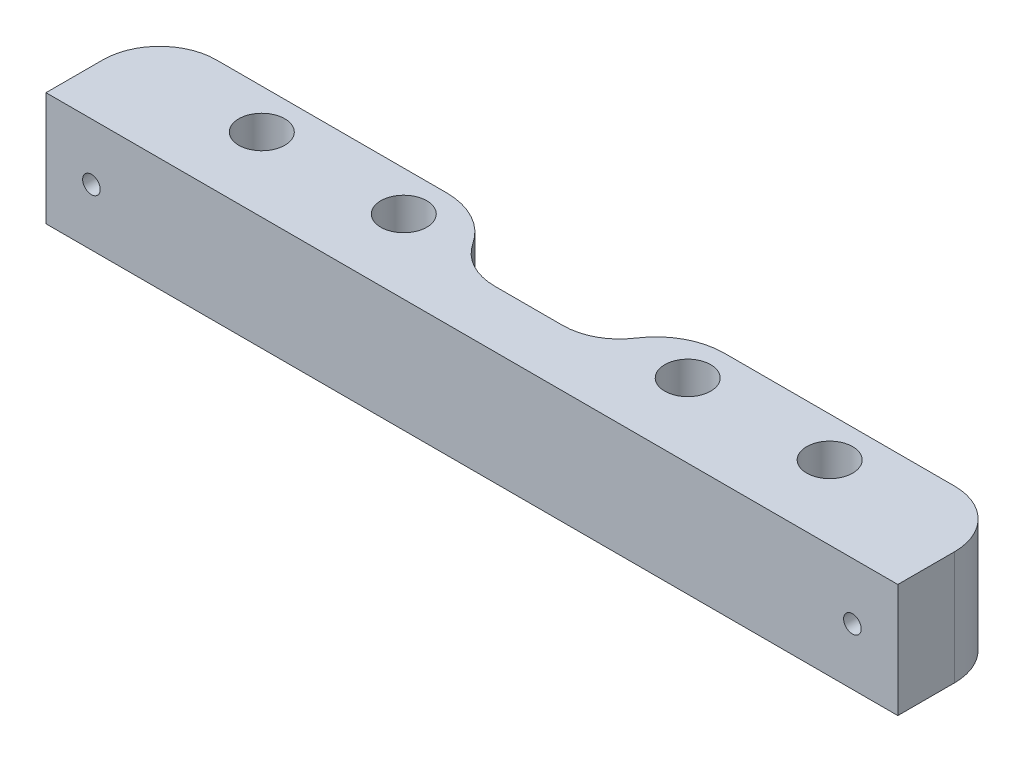
ISO-10303-21;
HEADER;
FILE_DESCRIPTION(('STEP AP214'),'2;1');
FILE_NAME('part.step','',(''),(''),'','','');
FILE_SCHEMA(('AUTOMOTIVE_DESIGN { 1 0 10303 214 1 1 1 1 }'));
ENDSEC;
DATA;
#1=APPLICATION_CONTEXT('core data for automotive mechanical design processes');
#2=APPLICATION_PROTOCOL_DEFINITION('international standard','automotive_design',2000,#1);
#3=PRODUCT_CONTEXT('',#1,'mechanical');
#4=PRODUCT('Part','Part','',(#3));
#5=PRODUCT_RELATED_PRODUCT_CATEGORY('part','',(#4));
#6=PRODUCT_DEFINITION_FORMATION('','',#4);
#7=PRODUCT_DEFINITION_CONTEXT('part definition',#1,'design');
#8=PRODUCT_DEFINITION('design','',#6,#7);
#9=PRODUCT_DEFINITION_SHAPE('','',#8);
#10=(LENGTH_UNIT() NAMED_UNIT(*) SI_UNIT(.MILLI.,.METRE.));
#11=(NAMED_UNIT(*) PLANE_ANGLE_UNIT() SI_UNIT($,.RADIAN.));
#12=(NAMED_UNIT(*) SI_UNIT($,.STERADIAN.) SOLID_ANGLE_UNIT());
#13=UNCERTAINTY_MEASURE_WITH_UNIT(LENGTH_MEASURE(1.E-05),#10,'distance_accuracy_value','');
#14=(GEOMETRIC_REPRESENTATION_CONTEXT(3) GLOBAL_UNCERTAINTY_ASSIGNED_CONTEXT((#13)) GLOBAL_UNIT_ASSIGNED_CONTEXT((#10,
#11,#12)) REPRESENTATION_CONTEXT('',''));
#15=CARTESIAN_POINT('',(0.,0.,0.));
#16=DIRECTION('',(0.,0.,1.));
#17=DIRECTION('',(1.,0.,0.));
#18=AXIS2_PLACEMENT_3D('',#15,#16,#17);
#19=CARTESIAN_POINT('',(-75.,20.,-10.));
#20=DIRECTION('',(0.,0.,1.));
#21=DIRECTION('',(1.,0.,0.));
#22=AXIS2_PLACEMENT_3D('',#19,#20,#21);
#23=PLANE('',#22);
#24=DIRECTION('',(-1.,0.,0.));
#25=VECTOR('',#24,1.);
#26=CARTESIAN_POINT('',(-75.,20.,-10.));
#27=LINE('',#26,#25);
#28=CARTESIAN_POINT('',(-24.4390889145858,20.,-10.));
#29=VERTEX_POINT('',#28);
#30=CARTESIAN_POINT('',(-65.,20.,-10.));
#31=VERTEX_POINT('',#30);
#32=EDGE_CURVE('E213',#29,#31,#27,.T.);
#33=ORIENTED_EDGE('',*,*,#32,.F.);
#34=DIRECTION('',(0.,1.,0.));
#35=VECTOR('',#34,1.);
#36=CARTESIAN_POINT('',(-24.4390889145858,20.,-10.));
#37=LINE('',#36,#35);
#38=CARTESIAN_POINT('',(-24.4390889145858,0.,-10.));
#39=VERTEX_POINT('',#38);
#40=EDGE_CURVE('E41',#29,#39,#37,.F.);
#41=ORIENTED_EDGE('',*,*,#40,.T.);
#42=DIRECTION('',(-1.,0.,0.));
#43=VECTOR('',#42,1.);
#44=CARTESIAN_POINT('',(-75.,0.,-10.));
#45=LINE('',#44,#43);
#46=CARTESIAN_POINT('',(-65.,0.,-10.));
#47=VERTEX_POINT('',#46);
#48=EDGE_CURVE('E225',#39,#47,#45,.T.);
#49=ORIENTED_EDGE('',*,*,#48,.T.);
#50=DIRECTION('',(0.,-1.,0.));
#51=VECTOR('',#50,1.);
#52=CARTESIAN_POINT('',(-65.,20.,-10.));
#53=LINE('',#52,#51);
#54=CARTESIAN_POINT('',(-65.,7.12771867673097,-10.));
#55=VERTEX_POINT('',#54);
#56=EDGE_CURVE('E238',#47,#55,#53,.F.);
#57=ORIENTED_EDGE('',*,*,#56,.T.);
#58=CARTESIAN_POINT('',(-67.,10.,-10.));
#59=DIRECTION('',(0.,0.,-1.));
#60=DIRECTION('',(-1.,0.,0.));
#61=AXIS2_PLACEMENT_3D('',#58,#59,#60);
#62=CIRCLE('',#61,3.50000000000001);
#63=CARTESIAN_POINT('',(-65.,12.872281323269,-10.));
#64=VERTEX_POINT('',#63);
#65=EDGE_CURVE('E166',#64,#55,#62,.T.);
#66=ORIENTED_EDGE('',*,*,#65,.F.);
#67=EDGE_CURVE('E237',#64,#31,#53,.F.);
#68=ORIENTED_EDGE('',*,*,#67,.T.);
#69=EDGE_LOOP('',(#33,#41,#49,#57,#66,#68));
#70=FACE_BOUND('',#69,.T.);
#71=ADVANCED_FACE('F33',(#70),#23,.F.);
#72=CARTESIAN_POINT('',(-67.,10.,10.));
#73=DIRECTION('',(0.,0.,-1.));
#74=DIRECTION('',(-1.,0.,0.));
#75=AXIS2_PLACEMENT_3D('',#72,#73,#74);
#76=CYLINDRICAL_SURFACE('',#75,1.54999999999999);
#77=CARTESIAN_POINT('',(-67.,10.,10.));
#78=DIRECTION('',(0.,0.,-1.));
#79=DIRECTION('',(-1.,0.,0.));
#80=AXIS2_PLACEMENT_3D('',#77,#78,#79);
#81=CIRCLE('',#80,1.54999999999999);
#82=CARTESIAN_POINT('',(-68.55,10.,10.));
#83=VERTEX_POINT('',#82);
#84=EDGE_CURVE('E178',#83,#83,#81,.T.);
#85=ORIENTED_EDGE('',*,*,#84,.F.);
#86=EDGE_LOOP('',(#85));
#87=FACE_BOUND('',#86,.T.);
#88=CARTESIAN_POINT('',(-67.,10.,-7.));
#89=DIRECTION('',(0.,0.,-1.));
#90=DIRECTION('',(-1.,0.,0.));
#91=AXIS2_PLACEMENT_3D('',#88,#89,#90);
#92=CIRCLE('',#91,1.54999999999999);
#93=CARTESIAN_POINT('',(-68.55,10.,-7.));
#94=VERTEX_POINT('',#93);
#95=EDGE_CURVE('E162',#94,#94,#92,.T.);
#96=ORIENTED_EDGE('',*,*,#95,.T.);
#97=EDGE_LOOP('',(#96));
#98=FACE_BOUND('',#97,.T.);
#99=ADVANCED_FACE('F283',(#87,#98),#76,.F.);
#100=CARTESIAN_POINT('',(67.,10.,10.));
#101=DIRECTION('',(0.,0.,-1.));
#102=DIRECTION('',(-1.,0.,0.));
#103=AXIS2_PLACEMENT_3D('',#100,#101,#102);
#104=CYLINDRICAL_SURFACE('',#103,1.54999999999999);
#105=CARTESIAN_POINT('',(67.,10.,10.));
#106=DIRECTION('',(0.,0.,-1.));
#107=DIRECTION('',(-1.,0.,0.));
#108=AXIS2_PLACEMENT_3D('',#105,#106,#107);
#109=CIRCLE('',#108,1.54999999999999);
#110=CARTESIAN_POINT('',(65.45,10.,10.));
#111=VERTEX_POINT('',#110);
#112=EDGE_CURVE('E182',#111,#111,#109,.T.);
#113=ORIENTED_EDGE('',*,*,#112,.F.);
#114=EDGE_LOOP('',(#113));
#115=FACE_BOUND('',#114,.T.);
#116=CARTESIAN_POINT('',(67.,10.,-7.));
#117=DIRECTION('',(0.,0.,-1.));
#118=DIRECTION('',(-1.,0.,0.));
#119=AXIS2_PLACEMENT_3D('',#116,#117,#118);
#120=CIRCLE('',#119,1.54999999999999);
#121=CARTESIAN_POINT('',(65.45,10.,-7.));
#122=VERTEX_POINT('',#121);
#123=EDGE_CURVE('E170',#122,#122,#120,.T.);
#124=ORIENTED_EDGE('',*,*,#123,.T.);
#125=EDGE_LOOP('',(#124));
#126=FACE_BOUND('',#125,.T.);
#127=ADVANCED_FACE('F286',(#115,#126),#104,.F.);
#128=CARTESIAN_POINT('',(0.,20.,0.));
#129=DIRECTION('',(0.,1.,0.));
#130=DIRECTION('',(0.,0.,1.));
#131=AXIS2_PLACEMENT_3D('',#128,#129,#130);
#132=PLANE('',#131);
#133=CARTESIAN_POINT('',(65.,20.,-10.));
#134=VERTEX_POINT('',#133);
#135=CARTESIAN_POINT('',(24.4390889145858,20.,-10.));
#136=VERTEX_POINT('',#135);
#137=EDGE_CURVE('E215',#134,#136,#27,.T.);
#138=ORIENTED_EDGE('',*,*,#137,.T.);
#139=CARTESIAN_POINT('',(24.4390889145858,20.,2.));
#140=DIRECTION('',(0.,1.,0.));
#141=DIRECTION('',(0.,0.,1.));
#142=AXIS2_PLACEMENT_3D('',#139,#140,#141);
#143=CIRCLE('',#142,12.);
#144=CARTESIAN_POINT('',(14.3814040520844,20.,-4.54545454545454));
#145=VERTEX_POINT('',#144);
#146=EDGE_CURVE('E346',#136,#145,#143,.T.);
#147=ORIENTED_EDGE('',*,*,#146,.T.);
#148=CARTESIAN_POINT('',(6.,20.,-10.));
#149=DIRECTION('',(0.,1.,0.));
#150=DIRECTION('',(0.,0.,1.));
#151=AXIS2_PLACEMENT_3D('',#148,#149,#150);
#152=CIRCLE('',#151,10.);
#153=CARTESIAN_POINT('',(6.00000000000001,20.,0.));
#154=VERTEX_POINT('',#153);
#155=EDGE_CURVE('E139',#154,#145,#152,.T.);
#156=ORIENTED_EDGE('',*,*,#155,.F.);
#157=DIRECTION('',(1.,0.,0.));
#158=VECTOR('',#157,1.);
#159=CARTESIAN_POINT('',(-6.00000000000001,20.,0.));
#160=LINE('',#159,#158);
#161=CARTESIAN_POINT('',(-6.00000000000001,20.,0.));
#162=VERTEX_POINT('',#161);
#163=EDGE_CURVE('E158',#162,#154,#160,.T.);
#164=ORIENTED_EDGE('',*,*,#163,.F.);
#165=CARTESIAN_POINT('',(-6.,20.,-10.));
#166=DIRECTION('',(0.,1.,0.));
#167=DIRECTION('',(0.,0.,1.));
#168=AXIS2_PLACEMENT_3D('',#165,#166,#167);
#169=CIRCLE('',#168,10.);
#170=CARTESIAN_POINT('',(-14.3814040520844,20.,-4.54545454545454));
#171=VERTEX_POINT('',#170);
#172=EDGE_CURVE('E145',#171,#162,#169,.T.);
#173=ORIENTED_EDGE('',*,*,#172,.F.);
#174=CARTESIAN_POINT('',(-24.4390889145858,20.,2.));
#175=DIRECTION('',(0.,1.,0.));
#176=DIRECTION('',(0.,0.,1.));
#177=AXIS2_PLACEMENT_3D('',#174,#175,#176);
#178=CIRCLE('',#177,12.);
#179=EDGE_CURVE('E339',#171,#29,#178,.T.);
#180=ORIENTED_EDGE('',*,*,#179,.T.);
#181=ORIENTED_EDGE('',*,*,#32,.T.);
#182=CARTESIAN_POINT('',(-65.,20.,0.));
#183=DIRECTION('',(0.,1.,0.));
#184=DIRECTION('',(0.,0.,1.));
#185=AXIS2_PLACEMENT_3D('',#182,#183,#184);
#186=CIRCLE('',#185,10.);
#187=CARTESIAN_POINT('',(-75.,20.,0.));
#188=VERTEX_POINT('',#187);
#189=EDGE_CURVE('E252',#31,#188,#186,.T.);
#190=ORIENTED_EDGE('',*,*,#189,.T.);
#191=DIRECTION('',(0.,0.,1.));
#192=VECTOR('',#191,1.);
#193=CARTESIAN_POINT('',(-75.,20.,-10.));
#194=LINE('',#193,#192);
#195=CARTESIAN_POINT('',(-75.,20.,10.));
#196=VERTEX_POINT('',#195);
#197=EDGE_CURVE('E218',#188,#196,#194,.T.);
#198=ORIENTED_EDGE('',*,*,#197,.T.);
#199=DIRECTION('',(1.,0.,0.));
#200=VECTOR('',#199,1.);
#201=CARTESIAN_POINT('',(-75.,20.,10.));
#202=LINE('',#201,#200);
#203=CARTESIAN_POINT('',(75.,20.,10.));
#204=VERTEX_POINT('',#203);
#205=EDGE_CURVE('E220',#196,#204,#202,.T.);
#206=ORIENTED_EDGE('',*,*,#205,.T.);
#207=DIRECTION('',(0.,0.,-1.));
#208=VECTOR('',#207,1.);
#209=CARTESIAN_POINT('',(75.,20.,-10.));
#210=LINE('',#209,#208);
#211=CARTESIAN_POINT('',(75.,20.,0.));
#212=VERTEX_POINT('',#211);
#213=EDGE_CURVE('E210',#204,#212,#210,.T.);
#214=ORIENTED_EDGE('',*,*,#213,.T.);
#215=CARTESIAN_POINT('',(65.,20.,0.));
#216=DIRECTION('',(0.,1.,0.));
#217=DIRECTION('',(0.,0.,1.));
#218=AXIS2_PLACEMENT_3D('',#215,#216,#217);
#219=CIRCLE('',#218,10.);
#220=EDGE_CURVE('E254',#212,#134,#219,.T.);
#221=ORIENTED_EDGE('',*,*,#220,.T.);
#222=EDGE_LOOP('',(#138,#147,#156,#164,#173,#180,#181,#190,#198,#206,#214,#221));
#223=FACE_BOUND('',#222,.T.);
#224=CARTESIAN_POINT('',(-50.,20.,-3.));
#225=DIRECTION('',(0.,1.,0.));
#226=DIRECTION('',(0.,0.,1.));
#227=AXIS2_PLACEMENT_3D('',#224,#225,#226);
#228=CIRCLE('',#227,4.05);
#229=CARTESIAN_POINT('',(-50.,20.,1.05));
#230=VERTEX_POINT('',#229);
#231=EDGE_CURVE('E192',#230,#230,#228,.T.);
#232=ORIENTED_EDGE('',*,*,#231,.F.);
#233=EDGE_LOOP('',(#232));
#234=FACE_BOUND('',#233,.T.);
#235=CARTESIAN_POINT('',(-25.,20.,-3.));
#236=DIRECTION('',(0.,1.,0.));
#237=DIRECTION('',(0.,0.,1.));
#238=AXIS2_PLACEMENT_3D('',#235,#236,#237);
#239=CIRCLE('',#238,4.05);
#240=CARTESIAN_POINT('',(-25.,20.,1.05));
#241=VERTEX_POINT('',#240);
#242=EDGE_CURVE('E204',#241,#241,#239,.T.);
#243=ORIENTED_EDGE('',*,*,#242,.F.);
#244=EDGE_LOOP('',(#243));
#245=FACE_BOUND('',#244,.T.);
#246=CARTESIAN_POINT('',(25.,20.,-3.));
#247=DIRECTION('',(0.,1.,0.));
#248=DIRECTION('',(0.,0.,1.));
#249=AXIS2_PLACEMENT_3D('',#246,#247,#248);
#250=CIRCLE('',#249,4.05);
#251=CARTESIAN_POINT('',(25.,20.,1.05));
#252=VERTEX_POINT('',#251);
#253=EDGE_CURVE('E198',#252,#252,#250,.T.);
#254=ORIENTED_EDGE('',*,*,#253,.F.);
#255=EDGE_LOOP('',(#254));
#256=FACE_BOUND('',#255,.T.);
#257=CARTESIAN_POINT('',(50.,20.,-3.));
#258=DIRECTION('',(0.,1.,0.));
#259=DIRECTION('',(0.,0.,1.));
#260=AXIS2_PLACEMENT_3D('',#257,#258,#259);
#261=CIRCLE('',#260,4.05);
#262=CARTESIAN_POINT('',(50.,20.,1.05000000000001));
#263=VERTEX_POINT('',#262);
#264=EDGE_CURVE('E186',#263,#263,#261,.T.);
#265=ORIENTED_EDGE('',*,*,#264,.F.);
#266=EDGE_LOOP('',(#265));
#267=FACE_BOUND('',#266,.T.);
#268=ADVANCED_FACE('F290',(#223,#234,#245,#256,#267),#132,.T.);
#269=CARTESIAN_POINT('',(0.,0.,0.));
#270=DIRECTION('',(0.,1.,0.));
#271=DIRECTION('',(0.,0.,1.));
#272=AXIS2_PLACEMENT_3D('',#269,#270,#271);
#273=PLANE('',#272);
#274=CARTESIAN_POINT('',(6.,0.,-10.));
#275=DIRECTION('',(0.,1.,0.));
#276=DIRECTION('',(0.,0.,1.));
#277=AXIS2_PLACEMENT_3D('',#274,#275,#276);
#278=CIRCLE('',#277,10.);
#279=CARTESIAN_POINT('',(6.00000000000001,0.,0.));
#280=VERTEX_POINT('',#279);
#281=CARTESIAN_POINT('',(14.3814040520844,0.,-4.54545454545454));
#282=VERTEX_POINT('',#281);
#283=EDGE_CURVE('E150',#280,#282,#278,.T.);
#284=ORIENTED_EDGE('',*,*,#283,.T.);
#285=CARTESIAN_POINT('',(24.4390889145858,0.,2.));
#286=DIRECTION('',(0.,1.,0.));
#287=DIRECTION('',(0.,0.,1.));
#288=AXIS2_PLACEMENT_3D('',#285,#286,#287);
#289=CIRCLE('',#288,12.);
#290=CARTESIAN_POINT('',(24.4390889145858,0.,-10.));
#291=VERTEX_POINT('',#290);
#292=EDGE_CURVE('E340',#282,#291,#289,.F.);
#293=ORIENTED_EDGE('',*,*,#292,.T.);
#294=CARTESIAN_POINT('',(65.,0.,-10.));
#295=VERTEX_POINT('',#294);
#296=EDGE_CURVE('E226',#295,#291,#45,.T.);
#297=ORIENTED_EDGE('',*,*,#296,.F.);
#298=CARTESIAN_POINT('',(65.,0.,0.));
#299=DIRECTION('',(0.,1.,0.));
#300=DIRECTION('',(0.,0.,1.));
#301=AXIS2_PLACEMENT_3D('',#298,#299,#300);
#302=CIRCLE('',#301,10.);
#303=CARTESIAN_POINT('',(75.,0.,0.));
#304=VERTEX_POINT('',#303);
#305=EDGE_CURVE('E248',#295,#304,#302,.F.);
#306=ORIENTED_EDGE('',*,*,#305,.T.);
#307=DIRECTION('',(0.,0.,-1.));
#308=VECTOR('',#307,1.);
#309=CARTESIAN_POINT('',(75.,0.,-10.));
#310=LINE('',#309,#308);
#311=CARTESIAN_POINT('',(75.,0.,10.));
#312=VERTEX_POINT('',#311);
#313=EDGE_CURVE('E207',#312,#304,#310,.T.);
#314=ORIENTED_EDGE('',*,*,#313,.F.);
#315=DIRECTION('',(1.,0.,0.));
#316=VECTOR('',#315,1.);
#317=CARTESIAN_POINT('',(-75.,0.,10.));
#318=LINE('',#317,#316);
#319=CARTESIAN_POINT('',(-75.,0.,10.));
#320=VERTEX_POINT('',#319);
#321=EDGE_CURVE('E214',#320,#312,#318,.T.);
#322=ORIENTED_EDGE('',*,*,#321,.F.);
#323=DIRECTION('',(0.,0.,1.));
#324=VECTOR('',#323,1.);
#325=CARTESIAN_POINT('',(-75.,0.,-10.));
#326=LINE('',#325,#324);
#327=CARTESIAN_POINT('',(-75.,0.,0.));
#328=VERTEX_POINT('',#327);
#329=EDGE_CURVE('E229',#328,#320,#326,.T.);
#330=ORIENTED_EDGE('',*,*,#329,.F.);
#331=CARTESIAN_POINT('',(-65.,0.,0.));
#332=DIRECTION('',(0.,1.,0.));
#333=DIRECTION('',(0.,0.,1.));
#334=AXIS2_PLACEMENT_3D('',#331,#332,#333);
#335=CIRCLE('',#334,10.);
#336=EDGE_CURVE('E245',#328,#47,#335,.F.);
#337=ORIENTED_EDGE('',*,*,#336,.T.);
#338=ORIENTED_EDGE('',*,*,#48,.F.);
#339=CARTESIAN_POINT('',(-24.4390889145858,0.,2.));
#340=DIRECTION('',(0.,1.,0.));
#341=DIRECTION('',(0.,0.,1.));
#342=AXIS2_PLACEMENT_3D('',#339,#340,#341);
#343=CIRCLE('',#342,12.);
#344=CARTESIAN_POINT('',(-14.3814040520844,0.,-4.54545454545454));
#345=VERTEX_POINT('',#344);
#346=EDGE_CURVE('E48',#39,#345,#343,.F.);
#347=ORIENTED_EDGE('',*,*,#346,.T.);
#348=CARTESIAN_POINT('',(-6.,0.,-10.));
#349=DIRECTION('',(0.,1.,0.));
#350=DIRECTION('',(0.,0.,1.));
#351=AXIS2_PLACEMENT_3D('',#348,#349,#350);
#352=CIRCLE('',#351,10.);
#353=CARTESIAN_POINT('',(-6.00000000000001,0.,0.));
#354=VERTEX_POINT('',#353);
#355=EDGE_CURVE('E131',#345,#354,#352,.T.);
#356=ORIENTED_EDGE('',*,*,#355,.T.);
#357=DIRECTION('',(1.,0.,0.));
#358=VECTOR('',#357,1.);
#359=CARTESIAN_POINT('',(-6.00000000000001,0.,0.));
#360=LINE('',#359,#358);
#361=EDGE_CURVE('E137',#354,#280,#360,.T.);
#362=ORIENTED_EDGE('',*,*,#361,.T.);
#363=EDGE_LOOP('',(#284,#293,#297,#306,#314,#322,#330,#337,#338,#347,#356,#362));
#364=FACE_BOUND('',#363,.T.);
#365=CARTESIAN_POINT('',(-50.,0.,-3.));
#366=DIRECTION('',(0.,1.,0.));
#367=DIRECTION('',(0.,0.,1.));
#368=AXIS2_PLACEMENT_3D('',#365,#366,#367);
#369=CIRCLE('',#368,4.05);
#370=CARTESIAN_POINT('',(-50.,0.,1.05));
#371=VERTEX_POINT('',#370);
#372=EDGE_CURVE('E189',#371,#371,#369,.T.);
#373=ORIENTED_EDGE('',*,*,#372,.T.);
#374=EDGE_LOOP('',(#373));
#375=FACE_BOUND('',#374,.T.);
#376=CARTESIAN_POINT('',(-25.,0.,-3.));
#377=DIRECTION('',(0.,1.,0.));
#378=DIRECTION('',(0.,0.,1.));
#379=AXIS2_PLACEMENT_3D('',#376,#377,#378);
#380=CIRCLE('',#379,4.05);
#381=CARTESIAN_POINT('',(-25.,0.,1.05));
#382=VERTEX_POINT('',#381);
#383=EDGE_CURVE('E201',#382,#382,#380,.T.);
#384=ORIENTED_EDGE('',*,*,#383,.T.);
#385=EDGE_LOOP('',(#384));
#386=FACE_BOUND('',#385,.T.);
#387=CARTESIAN_POINT('',(25.,0.,-3.));
#388=DIRECTION('',(0.,1.,0.));
#389=DIRECTION('',(0.,0.,1.));
#390=AXIS2_PLACEMENT_3D('',#387,#388,#389);
#391=CIRCLE('',#390,4.05);
#392=CARTESIAN_POINT('',(25.,0.,1.05));
#393=VERTEX_POINT('',#392);
#394=EDGE_CURVE('E195',#393,#393,#391,.T.);
#395=ORIENTED_EDGE('',*,*,#394,.T.);
#396=EDGE_LOOP('',(#395));
#397=FACE_BOUND('',#396,.T.);
#398=CARTESIAN_POINT('',(50.,0.,-3.));
#399=DIRECTION('',(0.,1.,0.));
#400=DIRECTION('',(0.,0.,1.));
#401=AXIS2_PLACEMENT_3D('',#398,#399,#400);
#402=CIRCLE('',#401,4.05);
#403=CARTESIAN_POINT('',(50.,0.,1.05000000000001));
#404=VERTEX_POINT('',#403);
#405=EDGE_CURVE('E185',#404,#404,#402,.T.);
#406=ORIENTED_EDGE('',*,*,#405,.T.);
#407=EDGE_LOOP('',(#406));
#408=FACE_BOUND('',#407,.T.);
#409=ADVANCED_FACE('F134',(#364,#375,#386,#397,#408),#273,.F.);
#410=CARTESIAN_POINT('',(75.,20.,-10.));
#411=DIRECTION('',(-1.,0.,0.));
#412=DIRECTION('',(0.,0.,1.));
#413=AXIS2_PLACEMENT_3D('',#410,#411,#412);
#414=PLANE('',#413);
#415=ORIENTED_EDGE('',*,*,#313,.T.);
#416=DIRECTION('',(0.,-1.,0.));
#417=VECTOR('',#416,1.);
#418=CARTESIAN_POINT('',(75.,20.,0.));
#419=LINE('',#418,#417);
#420=EDGE_CURVE('E250',#304,#212,#419,.F.);
#421=ORIENTED_EDGE('',*,*,#420,.T.);
#422=ORIENTED_EDGE('',*,*,#213,.F.);
#423=DIRECTION('',(0.,-1.,0.));
#424=VECTOR('',#423,1.);
#425=CARTESIAN_POINT('',(75.,20.,10.));
#426=LINE('',#425,#424);
#427=EDGE_CURVE('E222',#204,#312,#426,.T.);
#428=ORIENTED_EDGE('',*,*,#427,.T.);
#429=EDGE_LOOP('',(#415,#421,#422,#428));
#430=FACE_BOUND('',#429,.T.);
#431=ADVANCED_FACE('F314',(#430),#414,.F.);
#432=ORIENTED_EDGE('',*,*,#296,.T.);
#433=DIRECTION('',(0.,1.,0.));
#434=VECTOR('',#433,1.);
#435=CARTESIAN_POINT('',(24.4390889145858,20.,-10.));
#436=LINE('',#435,#434);
#437=EDGE_CURVE('E348',#291,#136,#436,.T.);
#438=ORIENTED_EDGE('',*,*,#437,.T.);
#439=ORIENTED_EDGE('',*,*,#137,.F.);
#440=DIRECTION('',(0.,-1.,0.));
#441=VECTOR('',#440,1.);
#442=CARTESIAN_POINT('',(65.,20.,-10.));
#443=LINE('',#442,#441);
#444=CARTESIAN_POINT('',(65.,12.872281323269,-10.));
#445=VERTEX_POINT('',#444);
#446=EDGE_CURVE('E242',#134,#445,#443,.T.);
#447=ORIENTED_EDGE('',*,*,#446,.T.);
#448=CARTESIAN_POINT('',(67.,10.,-10.));
#449=DIRECTION('',(0.,0.,-1.));
#450=DIRECTION('',(-1.,0.,0.));
#451=AXIS2_PLACEMENT_3D('',#448,#449,#450);
#452=CIRCLE('',#451,3.50000000000001);
#453=CARTESIAN_POINT('',(65.,7.12771867673098,-10.));
#454=VERTEX_POINT('',#453);
#455=EDGE_CURVE('E174',#454,#445,#452,.T.);
#456=ORIENTED_EDGE('',*,*,#455,.F.);
#457=EDGE_CURVE('E241',#454,#295,#443,.T.);
#458=ORIENTED_EDGE('',*,*,#457,.T.);
#459=EDGE_LOOP('',(#432,#438,#439,#447,#456,#458));
#460=FACE_BOUND('',#459,.T.);
#461=ADVANCED_FACE('F321',(#460),#23,.F.);
#462=CARTESIAN_POINT('',(-75.,20.,-10.));
#463=DIRECTION('',(1.,0.,0.));
#464=DIRECTION('',(0.,0.,-1.));
#465=AXIS2_PLACEMENT_3D('',#462,#463,#464);
#466=PLANE('',#465);
#467=ORIENTED_EDGE('',*,*,#197,.F.);
#468=DIRECTION('',(0.,-1.,0.));
#469=VECTOR('',#468,1.);
#470=CARTESIAN_POINT('',(-75.,20.,0.));
#471=LINE('',#470,#469);
#472=EDGE_CURVE('E256',#188,#328,#471,.T.);
#473=ORIENTED_EDGE('',*,*,#472,.T.);
#474=ORIENTED_EDGE('',*,*,#329,.T.);
#475=DIRECTION('',(0.,-1.,0.));
#476=VECTOR('',#475,1.);
#477=CARTESIAN_POINT('',(-75.,20.,10.));
#478=LINE('',#477,#476);
#479=EDGE_CURVE('E234',#196,#320,#478,.T.);
#480=ORIENTED_EDGE('',*,*,#479,.F.);
#481=EDGE_LOOP('',(#467,#473,#474,#480));
#482=FACE_BOUND('',#481,.T.);
#483=ADVANCED_FACE('F317',(#482),#466,.F.);
#484=CARTESIAN_POINT('',(-75.,20.,10.));
#485=DIRECTION('',(0.,0.,-1.));
#486=DIRECTION('',(-1.,0.,0.));
#487=AXIS2_PLACEMENT_3D('',#484,#485,#486);
#488=PLANE('',#487);
#489=ORIENTED_EDGE('',*,*,#84,.T.);
#490=EDGE_LOOP('',(#489));
#491=FACE_BOUND('',#490,.T.);
#492=ORIENTED_EDGE('',*,*,#112,.T.);
#493=EDGE_LOOP('',(#492));
#494=FACE_BOUND('',#493,.T.);
#495=ORIENTED_EDGE('',*,*,#321,.T.);
#496=ORIENTED_EDGE('',*,*,#427,.F.);
#497=ORIENTED_EDGE('',*,*,#205,.F.);
#498=ORIENTED_EDGE('',*,*,#479,.T.);
#499=EDGE_LOOP('',(#495,#496,#497,#498));
#500=FACE_BOUND('',#499,.T.);
#501=ADVANCED_FACE('F307',(#491,#494,#500),#488,.F.);
#502=CARTESIAN_POINT('',(-25.,20.,-3.));
#503=DIRECTION('',(0.,-1.,0.));
#504=DIRECTION('',(0.,0.,-1.));
#505=AXIS2_PLACEMENT_3D('',#502,#503,#504);
#506=CYLINDRICAL_SURFACE('',#505,4.05);
#507=ORIENTED_EDGE('',*,*,#242,.T.);
#508=EDGE_LOOP('',(#507));
#509=FACE_BOUND('',#508,.T.);
#510=ORIENTED_EDGE('',*,*,#383,.F.);
#511=EDGE_LOOP('',(#510));
#512=FACE_BOUND('',#511,.T.);
#513=ADVANCED_FACE('F303',(#509,#512),#506,.F.);
#514=CARTESIAN_POINT('',(25.,20.,-3.));
#515=DIRECTION('',(0.,-1.,0.));
#516=DIRECTION('',(0.,0.,-1.));
#517=AXIS2_PLACEMENT_3D('',#514,#515,#516);
#518=CYLINDRICAL_SURFACE('',#517,4.05);
#519=ORIENTED_EDGE('',*,*,#253,.T.);
#520=EDGE_LOOP('',(#519));
#521=FACE_BOUND('',#520,.T.);
#522=ORIENTED_EDGE('',*,*,#394,.F.);
#523=EDGE_LOOP('',(#522));
#524=FACE_BOUND('',#523,.T.);
#525=ADVANCED_FACE('F299',(#521,#524),#518,.F.);
#526=CARTESIAN_POINT('',(-50.,20.,-3.));
#527=DIRECTION('',(0.,-1.,0.));
#528=DIRECTION('',(0.,0.,-1.));
#529=AXIS2_PLACEMENT_3D('',#526,#527,#528);
#530=CYLINDRICAL_SURFACE('',#529,4.05);
#531=ORIENTED_EDGE('',*,*,#231,.T.);
#532=EDGE_LOOP('',(#531));
#533=FACE_BOUND('',#532,.T.);
#534=ORIENTED_EDGE('',*,*,#372,.F.);
#535=EDGE_LOOP('',(#534));
#536=FACE_BOUND('',#535,.T.);
#537=ADVANCED_FACE('F295',(#533,#536),#530,.F.);
#538=CARTESIAN_POINT('',(50.,20.,-3.));
#539=DIRECTION('',(0.,-1.,0.));
#540=DIRECTION('',(0.,0.,-1.));
#541=AXIS2_PLACEMENT_3D('',#538,#539,#540);
#542=CYLINDRICAL_SURFACE('',#541,4.05);
#543=ORIENTED_EDGE('',*,*,#264,.T.);
#544=EDGE_LOOP('',(#543));
#545=FACE_BOUND('',#544,.T.);
#546=ORIENTED_EDGE('',*,*,#405,.F.);
#547=EDGE_LOOP('',(#546));
#548=FACE_BOUND('',#547,.T.);
#549=ADVANCED_FACE('F292',(#545,#548),#542,.F.);
#550=CARTESIAN_POINT('',(65.,20.,0.));
#551=DIRECTION('',(0.,-1.,0.));
#552=DIRECTION('',(0.,0.,-1.));
#553=AXIS2_PLACEMENT_3D('',#550,#551,#552);
#554=CYLINDRICAL_SURFACE('',#553,10.);
#555=CARTESIAN_POINT('',(65.,12.872281323269,-10.));
#556=CARTESIAN_POINT('',(65.0774723121315,12.9262408040449,-10.0000072046618));
#557=CARTESIAN_POINT('',(65.1571443425918,12.9770481777834,-9.99910008749333));
#558=CARTESIAN_POINT('',(65.3202950245793,13.0720481667805,-9.99520039177261));
#559=CARTESIAN_POINT('',(65.4037738670128,13.1162404498245,-9.9922077085244));
#560=CARTESIAN_POINT('',(65.5738209150946,13.1976384452249,-9.98388571420544));
#561=CARTESIAN_POINT('',(65.6603847323547,13.2348536447471,-9.97855960942239));
#562=CARTESIAN_POINT('',(65.8360549451862,13.3021323359519,-9.96537852456422));
#563=CARTESIAN_POINT('',(65.9251612031611,13.3321962138439,-9.95752368110834));
#564=CARTESIAN_POINT('',(66.1053310839471,13.3850234020033,-9.93913686944534));
#565=CARTESIAN_POINT('',(66.1963962961756,13.4077805256165,-9.92860264605029));
#566=CARTESIAN_POINT('',(66.3797232078006,13.445872831908,-9.90479364207448));
#567=CARTESIAN_POINT('',(66.4719853369918,13.4612052682429,-9.8915178499915));
#568=CARTESIAN_POINT('',(66.7494025224459,13.4959735409278,-9.84756079730677));
#569=CARTESIAN_POINT('',(66.9354340660264,13.504251642245,-9.81272536634984));
#570=CARTESIAN_POINT('',(67.3044708700579,13.4916361523213,-9.732688587851));
#571=CARTESIAN_POINT('',(67.4874694729685,13.4706852643832,-9.6874670259803));
#572=CARTESIAN_POINT('',(67.8457517305361,13.4011792010235,-9.58834039193428));
#573=CARTESIAN_POINT('',(68.0210314795685,13.352610220311,-9.53443098668332));
#574=CARTESIAN_POINT('',(68.3709306476296,13.2260408647646,-9.41663626508817));
#575=CARTESIAN_POINT('',(68.5448033398666,13.1463694457997,-9.35233512494483));
#576=CARTESIAN_POINT('',(68.8762819710658,12.9606900198542,-9.21988856655219));
#577=CARTESIAN_POINT('',(69.0338810311414,12.8546709396654,-9.15174154131263));
#578=CARTESIAN_POINT('',(69.3422714227924,12.6088025181419,-9.00976314130535));
#579=CARTESIAN_POINT('',(69.4914067100965,12.4668730246504,-8.935930336686));
#580=CARTESIAN_POINT('',(69.7638138948105,12.1572654169027,-8.79373101287851));
#581=CARTESIAN_POINT('',(69.8870724445407,11.9895740910871,-8.72536732595548));
#582=CARTESIAN_POINT('',(70.0490901317839,11.7216091742549,-8.63195177861041));
#583=CARTESIAN_POINT('',(70.0992484994477,11.629642136472,-8.60235808119116));
#584=CARTESIAN_POINT('',(70.1914800112501,11.4406566800586,-8.54701236580688));
#585=CARTESIAN_POINT('',(70.2335576651992,11.3436411176396,-8.52125820681841));
#586=CARTESIAN_POINT('',(70.3089984998585,11.1453263064806,-8.47446212200593));
#587=CARTESIAN_POINT('',(70.3423727574207,11.0440326952107,-8.45341421143396));
#588=CARTESIAN_POINT('',(70.3999060268544,10.8379016286107,-8.41677981604759));
#589=CARTESIAN_POINT('',(70.4240671619345,10.7330649958569,-8.4011920729787));
#590=CARTESIAN_POINT('',(70.4599551935141,10.5359776595202,-8.37790411264895));
#591=CARTESIAN_POINT('',(70.4729603730656,10.4440530826325,-8.36939829826566));
#592=CARTESIAN_POINT('',(70.4916288451523,10.2591517396494,-8.35716092014002));
#593=CARTESIAN_POINT('',(70.4972931623038,10.1661751222225,-8.35342869011549));
#594=CARTESIAN_POINT('',(70.501179772275,9.98003222619056,-8.35086995141224));
#595=CARTESIAN_POINT('',(70.4994051295831,9.88686604148442,-8.35204142264769));
#596=CARTESIAN_POINT('',(70.4884628155627,9.70118544242581,-8.35923495069185));
#597=CARTESIAN_POINT('',(70.4792954903652,9.60867099776293,-8.36525678040305));
#598=CARTESIAN_POINT('',(70.4437289456966,9.35360541494402,-8.38848104562764));
#599=CARTESIAN_POINT('',(70.4094736092094,9.19252691762428,-8.41073618346617));
#600=CARTESIAN_POINT('',(70.3196205363264,8.87892647408692,-8.46784606725809));
#601=CARTESIAN_POINT('',(70.2640173899601,8.72640670806515,-8.50270400688785));
#602=CARTESIAN_POINT('',(70.1291803688072,8.42278004702344,-8.58476108981774));
#603=CARTESIAN_POINT('',(70.0486165372239,8.27244749142002,-8.63262886225356));
#604=CARTESIAN_POINT('',(69.8680262648798,7.98678547492546,-8.73573880813719));
#605=CARTESIAN_POINT('',(69.7679897751415,7.85146381734197,-8.790984784509));
#606=CARTESIAN_POINT('',(69.5339895645597,7.57801546903815,-8.91419856950499));
#607=CARTESIAN_POINT('',(69.3971780549421,7.44261214903021,-8.98282120673202));
#608=CARTESIAN_POINT('',(69.1034769644875,7.19603499272404,-9.12073823161908));
#609=CARTESIAN_POINT('',(68.9465750161998,7.08487619599688,-9.19003300854991));
#610=CARTESIAN_POINT('',(68.6011999461135,6.88075996744569,-9.33107115272676));
#611=CARTESIAN_POINT('',(68.4111736037586,6.79017828608663,-9.40251555873188));
#612=CARTESIAN_POINT('',(68.1145094348292,6.68050736516415,-9.50320181650742));
#613=CARTESIAN_POINT('',(68.013634609027,6.6483085071516,-9.53569736600695));
#614=CARTESIAN_POINT('',(67.8086435175706,6.59304499748398,-9.59807062293825));
#615=CARTESIAN_POINT('',(67.7045289535583,6.56997563516609,-9.627949674224));
#616=CARTESIAN_POINT('',(67.4984315107694,6.53416274648472,-9.68342583779259));
#617=CARTESIAN_POINT('',(67.3965540156202,6.52101238044744,-9.70915294187991));
#618=CARTESIAN_POINT('',(67.1913520310307,6.50371941784403,-9.75751390466497));
#619=CARTESIAN_POINT('',(67.0880282422281,6.4995726019272,-9.78014920761677));
#620=CARTESIAN_POINT('',(66.8807462123191,6.50049704306443,-9.8221167157148));
#621=CARTESIAN_POINT('',(66.7767879523072,6.50556857614903,-9.84144882193248));
#622=CARTESIAN_POINT('',(66.5691700963779,6.52505346548392,-9.87667899835391));
#623=CARTESIAN_POINT('',(66.4655104687707,6.53946579087003,-9.89257744724326));
#624=CARTESIAN_POINT('',(66.2682332143283,6.57600995906907,-9.91970972423952));
#625=CARTESIAN_POINT('',(66.1745123430564,6.59737966009724,-9.93122553581854));
#626=CARTESIAN_POINT('',(65.9888690171692,6.64785668953747,-9.95142471737237));
#627=CARTESIAN_POINT('',(65.8969464468369,6.67696351831087,-9.96010827016466));
#628=CARTESIAN_POINT('',(65.7157529391103,6.74270246352536,-9.97476571430807));
#629=CARTESIAN_POINT('',(65.626478668908,6.77932461853147,-9.98074315927326));
#630=CARTESIAN_POINT('',(65.4511882978495,6.85986020980216,-9.99020158334468));
#631=CARTESIAN_POINT('',(65.3651705788112,6.90376996486862,-9.9936838181623));
#632=CARTESIAN_POINT('',(65.2328601766448,6.97836345613622,-9.99740513568413));
#633=CARTESIAN_POINT('',(65.1852556245515,7.00671230093965,-9.99839386609436));
#634=CARTESIAN_POINT('',(65.0915207699485,7.06558949551656,-9.9996909132346));
#635=CARTESIAN_POINT('',(65.0453880275863,7.09611393439447,-10.0000004206144));
#636=CARTESIAN_POINT('',(65.,7.12771867673098,-10.));
#637=B_SPLINE_CURVE_WITH_KNOTS('',3,(#555,#556,#557,#558,#559,#560,#561,#562,#563,#564,#565,
#566,#567,#568,#569,#570,#571,#572,#573,#574,#575,#576,#577,#578,#579,#580,#581,#582,#583,#584,
#585,#586,#587,#588,#589,#590,#591,#592,#593,#594,#595,#596,#597,#598,#599,#600,#601,#602,#603,
#604,#605,#606,#607,#608,#609,#610,#611,#612,#613,#614,#615,#616,#617,#618,#619,#620,#621,#622,
#623,#624,#625,#626,#627,#628,#629,#630,#631,#632,#633,#634,#635,#636),.UNSPECIFIED.,.F.,.F.,(4,
2,2,2,2,2,2,2,2,2,2,2,2,2,2,2,2,2,2,2,2,2,2,2,2,2,2,2,2,2,2,2,2,2,2,2,2,2,2,2,4),(0.,
0.283159073267499,0.566332362215547,0.849117765272481,1.13188789294816,1.4148968155362,
1.69801034146394,2.26347622559063,2.83005213408053,3.39691150275325,3.99971754199945,
4.60277735399568,5.25598805424368,5.90953486875551,6.23570574238706,6.56169404909382,
6.88726542156427,7.21276171912934,7.49204885495505,7.77129700448767,8.05043012872085,
8.32955018448599,8.82568838999738,9.32195241012981,9.85135273946103,10.3810269966583,
10.9915325148321,11.6024156766605,12.2656431429192,12.5975639151566,12.9293131979795,
13.2465787704058,13.5636956299476,13.8808219852657,14.1979133479902,14.4879941592847,
14.7780562426491,15.0677363086932,15.3572704910254,15.5234558246199,15.689349608747),.UNSPECIFIED.);
#638=EDGE_CURVE('E259',#445,#454,#637,.T.);
#639=ORIENTED_EDGE('',*,*,#638,.F.);
#640=ORIENTED_EDGE('',*,*,#446,.F.);
#641=ORIENTED_EDGE('',*,*,#220,.F.);
#642=ORIENTED_EDGE('',*,*,#420,.F.);
#643=ORIENTED_EDGE('',*,*,#305,.F.);
#644=ORIENTED_EDGE('',*,*,#457,.F.);
#645=EDGE_LOOP('',(#639,#640,#641,#642,#643,#644));
#646=FACE_BOUND('',#645,.T.);
#647=ADVANCED_FACE('F272',(#646),#554,.T.);
#648=CARTESIAN_POINT('',(-65.,20.,0.));
#649=DIRECTION('',(0.,-1.,0.));
#650=DIRECTION('',(0.,0.,-1.));
#651=AXIS2_PLACEMENT_3D('',#648,#649,#650);
#652=CYLINDRICAL_SURFACE('',#651,10.);
#653=CARTESIAN_POINT('',(-65.,12.872281323269,-10.));
#654=CARTESIAN_POINT('',(-64.8395612419205,12.76055740342,-9.99999764337842));
#655=CARTESIAN_POINT('',(-64.6882576080701,12.6351544415425,-9.99611168658427));
#656=CARTESIAN_POINT('',(-64.408576973974,12.3607408364282,-9.98348523046953));
#657=CARTESIAN_POINT('',(-64.2802632574769,12.2116670973919,-9.9747315954545));
#658=CARTESIAN_POINT('',(-64.0505607337827,11.8944799524496,-9.95549297534904));
#659=CARTESIAN_POINT('',(-63.9491283200493,11.726398021364,-9.94501083959061));
#660=CARTESIAN_POINT('',(-63.7757772006183,11.3757285519318,-9.92516643849021));
#661=CARTESIAN_POINT('',(-63.7038395873447,11.1931503962549,-9.91580345845221));
#662=CARTESIAN_POINT('',(-63.5910145172949,10.8170785108286,-9.9004067304694));
#663=CARTESIAN_POINT('',(-63.5503493954878,10.6235169383663,-9.89439690341783));
#664=CARTESIAN_POINT('',(-63.502152119393,10.2322077832204,-9.88721710255721));
#665=CARTESIAN_POINT('',(-63.4946211263979,10.0344600540636,-9.88604729838246));
#666=CARTESIAN_POINT('',(-63.5128289681913,9.6426620254446,-9.88880150783851));
#667=CARTESIAN_POINT('',(-63.538214082408,9.44859478131194,-9.89267136655105));
#668=CARTESIAN_POINT('',(-63.6208759065215,9.06750824755443,-9.90453122299266));
#669=CARTESIAN_POINT('',(-63.6781540987446,8.88048928595098,-9.91252141222515));
#670=CARTESIAN_POINT('',(-63.8231101068026,8.51827383899097,-9.93077265175749));
#671=CARTESIAN_POINT('',(-63.910855282142,8.34310458614414,-9.94103871545635));
#672=CARTESIAN_POINT('',(-64.1143102210895,8.0097934497113,-9.96122318419487));
#673=CARTESIAN_POINT('',(-64.2300225829026,7.85165315012192,-9.97114155683527));
#674=CARTESIAN_POINT('',(-64.4874566616008,7.55541995758034,-9.98769460920423));
#675=CARTESIAN_POINT('',(-64.6294033007204,7.41752050231831,-9.99429890181172));
#676=CARTESIAN_POINT('',(-64.9345811874533,7.16752184457512,-10.0009477963054));
#677=CARTESIAN_POINT('',(-65.0978087109898,7.05541813740103,-10.0009935443747));
#678=CARTESIAN_POINT('',(-65.4373431462722,6.86224335526939,-9.99184579024385));
#679=CARTESIAN_POINT('',(-65.6133397273777,6.78061911476502,-9.98282920345936));
#680=CARTESIAN_POINT('',(-65.9755781568278,6.64772332878701,-9.9539543888158));
#681=CARTESIAN_POINT('',(-66.1618175444346,6.59644452761943,-9.93409875479302));
#682=CARTESIAN_POINT('',(-66.533203258806,6.52626978769173,-9.88349171020346));
#683=CARTESIAN_POINT('',(-66.7182284781977,6.50648954282975,-9.85306820091534));
#684=CARTESIAN_POINT('',(-67.0870065053746,6.49622051074885,-9.78159978003648));
#685=CARTESIAN_POINT('',(-67.2707591915582,6.50573448517317,-9.7405538673779));
#686=CARTESIAN_POINT('',(-67.635740403738,6.55320856103418,-9.64826444347898));
#687=CARTESIAN_POINT('',(-67.8168498383743,6.59171973926818,-9.59683768830275));
#688=CARTESIAN_POINT('',(-68.1686856758935,6.69578081998502,-9.48648918719237));
#689=CARTESIAN_POINT('',(-68.3394091172841,6.76133839347377,-9.42756531817881));
#690=CARTESIAN_POINT('',(-68.6799514949933,6.92331048873866,-9.30018838196443));
#691=CARTESIAN_POINT('',(-68.8486766000114,7.02172140102507,-9.23135073786755));
#692=CARTESIAN_POINT('',(-69.1671804816662,7.24478996080217,-9.09202327884484));
#693=CARTESIAN_POINT('',(-69.3169433214815,7.36946945434299,-9.0215321324318));
#694=CARTESIAN_POINT('',(-69.6042086383022,7.65233295427278,-8.87855623968869));
#695=CARTESIAN_POINT('',(-69.7401131392319,7.81225419679739,-8.80627875047091));
#696=CARTESIAN_POINT('',(-69.9825946148523,8.15654050389464,-8.67139139879087));
#697=CARTESIAN_POINT('',(-70.0892022276803,8.34087973120101,-8.6087714669496));
#698=CARTESIAN_POINT('',(-70.2502642335456,8.69044278105634,-8.5112713114117));
#699=CARTESIAN_POINT('',(-70.310910310183,8.85196453185232,-8.47334101533587));
#700=CARTESIAN_POINT('',(-70.4081020199546,9.18465230645185,-8.41164564842997));
#701=CARTESIAN_POINT('',(-70.4446715732881,9.35580857416882,-8.3878665205769));
#702=CARTESIAN_POINT('',(-70.4918896234648,9.70391533541725,-8.35703209110123));
#703=CARTESIAN_POINT('',(-70.5024324069141,9.88088651057662,-8.3500449970116));
#704=CARTESIAN_POINT('',(-70.4966214006497,10.2342038812943,-8.35387117070573));
#705=CARTESIAN_POINT('',(-70.4802661679265,10.4105500428136,-8.36468539348438));
#706=CARTESIAN_POINT('',(-70.423574581832,10.7457822929179,-8.40153867484599));
#707=CARTESIAN_POINT('',(-70.3848481820482,10.9050618933083,-8.426553844165));
#708=CARTESIAN_POINT('',(-70.2865303023924,11.2145392791955,-8.48857787958099));
#709=CARTESIAN_POINT('',(-70.2269328095627,11.3647344328257,-8.52559020182635));
#710=CARTESIAN_POINT('',(-70.0832407633236,11.6654282924461,-8.61209810092272));
#711=CARTESIAN_POINT('',(-69.997527575506,11.8149243173238,-8.6623730491989));
#712=CARTESIAN_POINT('',(-69.8065935384177,12.0981535170684,-8.76975846675202));
#713=CARTESIAN_POINT('',(-69.7013619168813,12.2318779205491,-8.82687270444875));
#714=CARTESIAN_POINT('',(-69.4561841183045,12.5010256514011,-8.95344552582167));
#715=CARTESIAN_POINT('',(-69.3133917936378,12.6336059661412,-9.02345937435955));
#716=CARTESIAN_POINT('',(-69.007780370018,12.8734323666505,-9.163296628805));
#717=CARTESIAN_POINT('',(-68.8449497263203,12.9806637431608,-9.23311990101426));
#718=CARTESIAN_POINT('',(-68.4896431983824,13.1740642136251,-9.37343542068843));
#719=CARTESIAN_POINT('',(-68.295871801034,13.2581297093619,-9.44360581102415));
#720=CARTESIAN_POINT('',(-67.9943566628024,13.3574544918072,-9.54175625361334));
#721=CARTESIAN_POINT('',(-67.8919990776434,13.3861065709617,-9.57330000592019));
#722=CARTESIAN_POINT('',(-67.6843361661769,13.4340963014383,-9.6335863968731));
#723=CARTESIAN_POINT('',(-67.5790324246526,13.4534388623049,-9.66233050556846));
#724=CARTESIAN_POINT('',(-67.3720003607858,13.4816580480002,-9.71516437200899));
#725=CARTESIAN_POINT('',(-67.2703830844453,13.4910402452289,-9.73942105388697));
#726=CARTESIAN_POINT('',(-67.0660635907442,13.5008696254903,-9.78480057568338));
#727=CARTESIAN_POINT('',(-66.9633619064332,13.5013210110501,-9.80592488494169));
#728=CARTESIAN_POINT('',(-66.757660550158,13.4931176040238,-9.84487641881369));
#729=CARTESIAN_POINT('',(-66.6546607937417,13.4844599125946,-9.86270259171573));
#730=CARTESIAN_POINT('',(-66.449319272016,13.4579566895711,-9.89496194010578));
#731=CARTESIAN_POINT('',(-66.3469774372143,13.4401121450253,-9.9093954798604));
#732=CARTESIAN_POINT('',(-66.1522511017318,13.3971210477172,-9.93383829475499));
#733=CARTESIAN_POINT('',(-66.0597399481204,13.372695788056,-9.94411381855016));
#734=CARTESIAN_POINT('',(-65.876792925732,13.3162580478996,-9.96191141073629));
#735=CARTESIAN_POINT('',(-65.7863569317549,13.2842460264622,-9.96943364565252));
#736=CARTESIAN_POINT('',(-65.608464661452,13.2129106980976,-9.98186888874491));
#737=CARTESIAN_POINT('',(-65.5210023752058,13.1736033204403,-9.98678749344457));
#738=CARTESIAN_POINT('',(-65.3495572615209,13.0879143086079,-9.99425667154477));
#739=CARTESIAN_POINT('',(-65.2655724620934,13.0415367555843,-9.99680860508906));
#740=CARTESIAN_POINT('',(-65.1524209312266,12.9728414665533,-9.99888715855812));
#741=CARTESIAN_POINT('',(-65.1214971637973,12.9533978203961,-9.99930865804748));
#742=CARTESIAN_POINT('',(-65.0602759809193,12.9135557060296,-9.99986528800595));
#743=CARTESIAN_POINT('',(-65.0299785178164,12.8931573108534,-10.0000004403426));
#744=CARTESIAN_POINT('',(-65.,12.872281323269,-10.));
#745=B_SPLINE_CURVE_WITH_KNOTS('',3,(#653,#654,#655,#656,#657,#658,#659,#660,#661,#662,#663,
#664,#665,#666,#667,#668,#669,#670,#671,#672,#673,#674,#675,#676,#677,#678,#679,#680,#681,#682,
#683,#684,#685,#686,#687,#688,#689,#690,#691,#692,#693,#694,#695,#696,#697,#698,#699,#700,#701,
#702,#703,#704,#705,#706,#707,#708,#709,#710,#711,#712,#713,#714,#715,#716,#717,#718,#719,#720,
#721,#722,#723,#724,#725,#726,#727,#728,#729,#730,#731,#732,#733,#734,#735,#736,#737,#738,#739,
#740,#741,#742,#743,#744),.UNSPECIFIED.,.T.,.F.,(4,2,2,2,2,2,2,2,2,2,2,2,2,2,2,2,2,2,2,2,2,2,2,
2,2,2,2,2,2,2,2,2,2,2,2,2,2,2,2,2,2,2,2,2,2,4),(0.,0.586384272388213,1.1743586680161,
1.76137333774159,2.34801111244085,2.93878204678815,3.52957368644465,4.1140689147768,
4.69859131154056,5.28441434635749,5.87029182618806,6.46144736385192,7.05249958997218,
7.63223313078013,8.21182799933378,8.77484448172619,9.3379140427911,9.91196336020523,
10.4861756038171,11.1048541269344,11.7240492143779,12.3866980553041,13.0486512502617,
13.5763936281723,14.1036108958307,14.6329660736648,15.162349650969,15.6576868222679,
16.1531668176648,16.6896342474781,17.2263986405994,17.8449120090562,18.4637834068188,
19.1277416251052,19.4599850764217,19.7920531205778,20.1063156448855,20.4204302847393,
20.7346449176634,21.0488257979726,21.3371658082948,21.6254883762647,21.913188649809,
22.2007234771887,22.3102997053587,22.4198675651918),.UNSPECIFIED.);
#746=EDGE_CURVE('E266',#55,#64,#745,.T.);
#747=ORIENTED_EDGE('',*,*,#746,.F.);
#748=ORIENTED_EDGE('',*,*,#56,.F.);
#749=ORIENTED_EDGE('',*,*,#336,.F.);
#750=ORIENTED_EDGE('',*,*,#472,.F.);
#751=ORIENTED_EDGE('',*,*,#189,.F.);
#752=ORIENTED_EDGE('',*,*,#67,.F.);
#753=EDGE_LOOP('',(#747,#748,#749,#750,#751,#752));
#754=FACE_BOUND('',#753,.T.);
#755=ADVANCED_FACE('F281',(#754),#652,.T.);
#756=CARTESIAN_POINT('',(67.,10.,-7.));
#757=DIRECTION('',(0.,0.,-1.));
#758=DIRECTION('',(-1.,0.,0.));
#759=AXIS2_PLACEMENT_3D('',#756,#757,#758);
#760=CYLINDRICAL_SURFACE('',#759,3.50000000000001);
#761=ORIENTED_EDGE('',*,*,#638,.T.);
#762=ORIENTED_EDGE('',*,*,#455,.T.);
#763=EDGE_LOOP('',(#761,#762));
#764=FACE_BOUND('',#763,.T.);
#765=CARTESIAN_POINT('',(67.,10.,-7.));
#766=DIRECTION('',(0.,0.,-1.));
#767=DIRECTION('',(-1.,0.,0.));
#768=AXIS2_PLACEMENT_3D('',#765,#766,#767);
#769=CIRCLE('',#768,3.50000000000001);
#770=CARTESIAN_POINT('',(63.5,10.,-7.));
#771=VERTEX_POINT('',#770);
#772=EDGE_CURVE('E175',#771,#771,#769,.T.);
#773=ORIENTED_EDGE('',*,*,#772,.F.);
#774=EDGE_LOOP('',(#773));
#775=FACE_BOUND('',#774,.T.);
#776=ADVANCED_FACE('F275',(#764,#775),#760,.F.);
#777=CARTESIAN_POINT('',(67.,10.,-7.));
#778=DIRECTION('',(0.,0.,-1.));
#779=DIRECTION('',(-1.,0.,0.));
#780=AXIS2_PLACEMENT_3D('',#777,#778,#779);
#781=PLANE('',#780);
#782=ORIENTED_EDGE('',*,*,#123,.F.);
#783=EDGE_LOOP('',(#782));
#784=FACE_BOUND('',#783,.T.);
#785=ORIENTED_EDGE('',*,*,#772,.T.);
#786=EDGE_LOOP('',(#785));
#787=FACE_BOUND('',#786,.T.);
#788=ADVANCED_FACE('F280',(#784,#787),#781,.T.);
#789=CARTESIAN_POINT('',(-67.,10.,-7.));
#790=DIRECTION('',(0.,0.,-1.));
#791=DIRECTION('',(-1.,0.,0.));
#792=AXIS2_PLACEMENT_3D('',#789,#790,#791);
#793=CYLINDRICAL_SURFACE('',#792,3.50000000000001);
#794=ORIENTED_EDGE('',*,*,#746,.T.);
#795=ORIENTED_EDGE('',*,*,#65,.T.);
#796=EDGE_LOOP('',(#794,#795));
#797=FACE_BOUND('',#796,.T.);
#798=CARTESIAN_POINT('',(-67.,10.,-7.));
#799=DIRECTION('',(0.,0.,-1.));
#800=DIRECTION('',(-1.,0.,0.));
#801=AXIS2_PLACEMENT_3D('',#798,#799,#800);
#802=CIRCLE('',#801,3.50000000000001);
#803=CARTESIAN_POINT('',(-70.5,10.,-7.));
#804=VERTEX_POINT('',#803);
#805=EDGE_CURVE('E167',#804,#804,#802,.T.);
#806=ORIENTED_EDGE('',*,*,#805,.F.);
#807=EDGE_LOOP('',(#806));
#808=FACE_BOUND('',#807,.T.);
#809=ADVANCED_FACE('F354',(#797,#808),#793,.F.);
#810=CARTESIAN_POINT('',(-67.,10.,-7.));
#811=DIRECTION('',(0.,0.,-1.));
#812=DIRECTION('',(-1.,0.,0.));
#813=AXIS2_PLACEMENT_3D('',#810,#811,#812);
#814=PLANE('',#813);
#815=ORIENTED_EDGE('',*,*,#95,.F.);
#816=EDGE_LOOP('',(#815));
#817=FACE_BOUND('',#816,.T.);
#818=ORIENTED_EDGE('',*,*,#805,.T.);
#819=EDGE_LOOP('',(#818));
#820=FACE_BOUND('',#819,.T.);
#821=ADVANCED_FACE('F442',(#817,#820),#814,.T.);
#822=CARTESIAN_POINT('',(-6.,0.,-10.));
#823=DIRECTION('',(0.,1.,0.));
#824=DIRECTION('',(0.,0.,1.));
#825=AXIS2_PLACEMENT_3D('',#822,#823,#824);
#826=CYLINDRICAL_SURFACE('',#825,10.);
#827=ORIENTED_EDGE('',*,*,#355,.F.);
#828=DIRECTION('',(0.,1.,0.));
#829=VECTOR('',#828,1.);
#830=CARTESIAN_POINT('',(-14.3814040520844,0.,-4.54545454545454));
#831=LINE('',#830,#829);
#832=EDGE_CURVE('E11',#345,#171,#831,.T.);
#833=ORIENTED_EDGE('',*,*,#832,.T.);
#834=ORIENTED_EDGE('',*,*,#172,.T.);
#835=DIRECTION('',(0.,1.,0.));
#836=VECTOR('',#835,1.);
#837=CARTESIAN_POINT('',(-6.00000000000001,0.,0.));
#838=LINE('',#837,#836);
#839=EDGE_CURVE('E142',#354,#162,#838,.T.);
#840=ORIENTED_EDGE('',*,*,#839,.F.);
#841=EDGE_LOOP('',(#827,#833,#834,#840));
#842=FACE_BOUND('',#841,.T.);
#843=ADVANCED_FACE('F143',(#842),#826,.F.);
#844=CARTESIAN_POINT('',(6.,0.,-10.));
#845=DIRECTION('',(0.,1.,0.));
#846=DIRECTION('',(0.,0.,1.));
#847=AXIS2_PLACEMENT_3D('',#844,#845,#846);
#848=CYLINDRICAL_SURFACE('',#847,10.);
#849=ORIENTED_EDGE('',*,*,#155,.T.);
#850=DIRECTION('',(0.,1.,0.));
#851=VECTOR('',#850,1.);
#852=CARTESIAN_POINT('',(14.3814040520844,0.,-4.54545454545454));
#853=LINE('',#852,#851);
#854=EDGE_CURVE('E344',#145,#282,#853,.F.);
#855=ORIENTED_EDGE('',*,*,#854,.T.);
#856=ORIENTED_EDGE('',*,*,#283,.F.);
#857=DIRECTION('',(0.,1.,0.));
#858=VECTOR('',#857,1.);
#859=CARTESIAN_POINT('',(6.00000000000001,0.,0.));
#860=LINE('',#859,#858);
#861=EDGE_CURVE('E149',#280,#154,#860,.T.);
#862=ORIENTED_EDGE('',*,*,#861,.T.);
#863=EDGE_LOOP('',(#849,#855,#856,#862));
#864=FACE_BOUND('',#863,.T.);
#865=ADVANCED_FACE('F380',(#864),#848,.F.);
#866=CARTESIAN_POINT('',(-6.00000000000001,0.,0.));
#867=DIRECTION('',(0.,0.,1.));
#868=DIRECTION('',(1.,0.,0.));
#869=AXIS2_PLACEMENT_3D('',#866,#867,#868);
#870=PLANE('',#869);
#871=ORIENTED_EDGE('',*,*,#163,.T.);
#872=ORIENTED_EDGE('',*,*,#861,.F.);
#873=ORIENTED_EDGE('',*,*,#361,.F.);
#874=ORIENTED_EDGE('',*,*,#839,.T.);
#875=EDGE_LOOP('',(#871,#872,#873,#874));
#876=FACE_BOUND('',#875,.T.);
#877=ADVANCED_FACE('F152',(#876),#870,.F.);
#878=CARTESIAN_POINT('',(24.4390889145858,0.,2.));
#879=DIRECTION('',(0.,1.,0.));
#880=DIRECTION('',(0.,0.,1.));
#881=AXIS2_PLACEMENT_3D('',#878,#879,#880);
#882=CYLINDRICAL_SURFACE('',#881,12.);
#883=ORIENTED_EDGE('',*,*,#292,.F.);
#884=ORIENTED_EDGE('',*,*,#854,.F.);
#885=ORIENTED_EDGE('',*,*,#146,.F.);
#886=ORIENTED_EDGE('',*,*,#437,.F.);
#887=EDGE_LOOP('',(#883,#884,#885,#886));
#888=FACE_BOUND('',#887,.T.);
#889=ADVANCED_FACE('F382',(#888),#882,.T.);
#890=CARTESIAN_POINT('',(-24.4390889145858,0.,2.));
#891=DIRECTION('',(0.,1.,0.));
#892=DIRECTION('',(0.,0.,1.));
#893=AXIS2_PLACEMENT_3D('',#890,#891,#892);
#894=CYLINDRICAL_SURFACE('',#893,12.);
#895=ORIENTED_EDGE('',*,*,#179,.F.);
#896=ORIENTED_EDGE('',*,*,#832,.F.);
#897=ORIENTED_EDGE('',*,*,#346,.F.);
#898=ORIENTED_EDGE('',*,*,#40,.F.);
#899=EDGE_LOOP('',(#895,#896,#897,#898));
#900=FACE_BOUND('',#899,.T.);
#901=ADVANCED_FACE('F35',(#900),#894,.T.);
#902=CLOSED_SHELL('',(#71,#99,#127,#268,#409,#431,#461,#483,#501,#513,#525,#537,#549,#647,#755,
#776,#788,#809,#821,#843,#865,#877,#889,#901));
#903=MANIFOLD_SOLID_BREP('B2',#902);
#904=ADVANCED_BREP_SHAPE_REPRESENTATION('',(#18,#903),#14);
#905=SHAPE_DEFINITION_REPRESENTATION(#9,#904);
ENDSEC;
END-ISO-10303-21;
